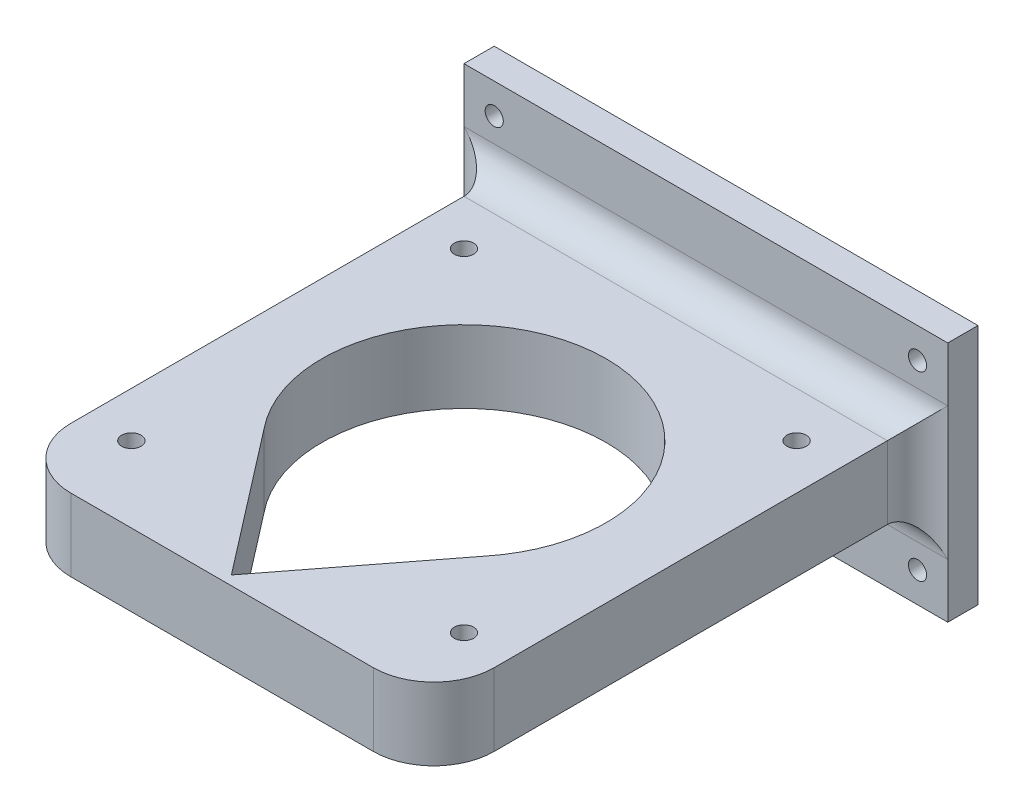
ISO-10303-21;
HEADER;
FILE_DESCRIPTION(('STEP AP214'),'2;1');
FILE_NAME('part.step','',(''),(''),'','','');
FILE_SCHEMA(('AUTOMOTIVE_DESIGN { 1 0 10303 214 1 1 1 1 }'));
ENDSEC;
DATA;
#1=APPLICATION_CONTEXT('core data for automotive mechanical design processes');
#2=APPLICATION_PROTOCOL_DEFINITION('international standard','automotive_design',2000,#1);
#3=PRODUCT_CONTEXT('',#1,'mechanical');
#4=PRODUCT('Part','Part','',(#3));
#5=PRODUCT_RELATED_PRODUCT_CATEGORY('part','',(#4));
#6=PRODUCT_DEFINITION_FORMATION('','',#4);
#7=PRODUCT_DEFINITION_CONTEXT('part definition',#1,'design');
#8=PRODUCT_DEFINITION('design','',#6,#7);
#9=PRODUCT_DEFINITION_SHAPE('','',#8);
#10=(LENGTH_UNIT() NAMED_UNIT(*) SI_UNIT(.MILLI.,.METRE.));
#11=(NAMED_UNIT(*) PLANE_ANGLE_UNIT() SI_UNIT($,.RADIAN.));
#12=(NAMED_UNIT(*) SI_UNIT($,.STERADIAN.) SOLID_ANGLE_UNIT());
#13=UNCERTAINTY_MEASURE_WITH_UNIT(LENGTH_MEASURE(1.E-05),#10,'distance_accuracy_value','');
#14=(GEOMETRIC_REPRESENTATION_CONTEXT(3) GLOBAL_UNCERTAINTY_ASSIGNED_CONTEXT((#13)) GLOBAL_UNIT_ASSIGNED_CONTEXT((#10,
#11,#12)) REPRESENTATION_CONTEXT('',''));
#15=CARTESIAN_POINT('',(0.,0.,0.));
#16=DIRECTION('',(0.,0.,1.));
#17=DIRECTION('',(1.,0.,0.));
#18=AXIS2_PLACEMENT_3D('',#15,#16,#17);
#19=CARTESIAN_POINT('',(25.,12.,30.));
#20=DIRECTION('',(0.,1.,0.));
#21=DIRECTION('',(0.,0.,1.));
#22=AXIS2_PLACEMENT_3D('',#19,#20,#21);
#23=CYLINDRICAL_SURFACE('',#22,10.);
#24=DIRECTION('',(0.,1.,0.));
#25=VECTOR('',#24,1.);
#26=CARTESIAN_POINT('',(25.,12.,40.));
#27=LINE('',#26,#25);
#28=CARTESIAN_POINT('',(25.,0.,40.));
#29=VERTEX_POINT('',#28);
#30=CARTESIAN_POINT('',(25.,12.,40.));
#31=VERTEX_POINT('',#30);
#32=EDGE_CURVE('E373',#29,#31,#27,.T.);
#33=ORIENTED_EDGE('',*,*,#32,.F.);
#34=CARTESIAN_POINT('',(25.,0.,30.));
#35=DIRECTION('',(0.,1.,0.));
#36=DIRECTION('',(0.,0.,1.));
#37=AXIS2_PLACEMENT_3D('',#34,#35,#36);
#38=CIRCLE('',#37,10.);
#39=CARTESIAN_POINT('',(35.,0.,30.));
#40=VERTEX_POINT('',#39);
#41=EDGE_CURVE('E53',#40,#29,#38,.F.);
#42=ORIENTED_EDGE('',*,*,#41,.F.);
#43=DIRECTION('',(0.,1.,0.));
#44=VECTOR('',#43,1.);
#45=CARTESIAN_POINT('',(35.,12.,30.));
#46=LINE('',#45,#44);
#47=CARTESIAN_POINT('',(35.,12.,30.));
#48=VERTEX_POINT('',#47);
#49=EDGE_CURVE('E377',#48,#40,#46,.F.);
#50=ORIENTED_EDGE('',*,*,#49,.F.);
#51=CARTESIAN_POINT('',(25.,12.,30.));
#52=DIRECTION('',(0.,1.,0.));
#53=DIRECTION('',(0.,0.,1.));
#54=AXIS2_PLACEMENT_3D('',#51,#52,#53);
#55=CIRCLE('',#54,10.);
#56=EDGE_CURVE('E11',#31,#48,#55,.T.);
#57=ORIENTED_EDGE('',*,*,#56,.F.);
#58=EDGE_LOOP('',(#33,#42,#50,#57));
#59=FACE_BOUND('',#58,.T.);
#60=ADVANCED_FACE('F45',(#59),#23,.T.);
#61=CARTESIAN_POINT('',(-25.,12.,30.));
#62=DIRECTION('',(0.,1.,0.));
#63=DIRECTION('',(0.,0.,1.));
#64=AXIS2_PLACEMENT_3D('',#61,#62,#63);
#65=CYLINDRICAL_SURFACE('',#64,10.);
#66=DIRECTION('',(0.,-1.,0.));
#67=VECTOR('',#66,1.);
#68=CARTESIAN_POINT('',(-25.,12.,40.));
#69=LINE('',#68,#67);
#70=CARTESIAN_POINT('',(-25.,12.,40.));
#71=VERTEX_POINT('',#70);
#72=CARTESIAN_POINT('',(-25.,0.,40.));
#73=VERTEX_POINT('',#72);
#74=EDGE_CURVE('E359',#71,#73,#69,.T.);
#75=ORIENTED_EDGE('',*,*,#74,.F.);
#76=CARTESIAN_POINT('',(-25.,12.,30.));
#77=DIRECTION('',(0.,1.,0.));
#78=DIRECTION('',(0.,0.,1.));
#79=AXIS2_PLACEMENT_3D('',#76,#77,#78);
#80=CIRCLE('',#79,10.);
#81=CARTESIAN_POINT('',(-35.,12.,30.));
#82=VERTEX_POINT('',#81);
#83=EDGE_CURVE('E367',#82,#71,#80,.T.);
#84=ORIENTED_EDGE('',*,*,#83,.F.);
#85=DIRECTION('',(0.,-1.,0.));
#86=VECTOR('',#85,1.);
#87=CARTESIAN_POINT('',(-35.,12.,30.));
#88=LINE('',#87,#86);
#89=CARTESIAN_POINT('',(-35.,0.,30.));
#90=VERTEX_POINT('',#89);
#91=EDGE_CURVE('E363',#90,#82,#88,.F.);
#92=ORIENTED_EDGE('',*,*,#91,.F.);
#93=CARTESIAN_POINT('',(-25.,0.,30.));
#94=DIRECTION('',(0.,1.,0.));
#95=DIRECTION('',(0.,0.,1.));
#96=AXIS2_PLACEMENT_3D('',#93,#94,#95);
#97=CIRCLE('',#96,10.);
#98=EDGE_CURVE('E370',#73,#90,#97,.F.);
#99=ORIENTED_EDGE('',*,*,#98,.F.);
#100=EDGE_LOOP('',(#75,#84,#92,#99));
#101=FACE_BOUND('',#100,.T.);
#102=ADVANCED_FACE('F389',(#101),#65,.T.);
#103=CARTESIAN_POINT('',(0.,12.,0.));
#104=DIRECTION('',(0.,-1.,0.));
#105=DIRECTION('',(0.,0.,-1.));
#106=AXIS2_PLACEMENT_3D('',#103,#104,#105);
#107=CYLINDRICAL_SURFACE('',#106,23.5);
#108=CARTESIAN_POINT('',(0.,12.,0.));
#109=DIRECTION('',(0.,1.,0.));
#110=DIRECTION('',(0.,0.,1.));
#111=AXIS2_PLACEMENT_3D('',#108,#109,#110);
#112=CIRCLE('',#111,23.5);
#113=CARTESIAN_POINT('',(18.2335117608208,12.,14.8252841074972));
#114=VERTEX_POINT('',#113);
#115=CARTESIAN_POINT('',(-18.2335117608211,12.,14.8252841074968));
#116=VERTEX_POINT('',#115);
#117=EDGE_CURVE('E290',#114,#116,#112,.T.);
#118=ORIENTED_EDGE('',*,*,#117,.T.);
#119=DIRECTION('',(0.,1.,0.));
#120=VECTOR('',#119,1.);
#121=CARTESIAN_POINT('',(-18.2335117608211,0.,14.8252841074968));
#122=LINE('',#121,#120);
#123=CARTESIAN_POINT('',(-18.2335117608211,0.,14.8252841074968));
#124=VERTEX_POINT('',#123);
#125=EDGE_CURVE('E180',#124,#116,#122,.T.);
#126=ORIENTED_EDGE('',*,*,#125,.F.);
#127=CARTESIAN_POINT('',(0.,0.,0.));
#128=DIRECTION('',(0.,1.,0.));
#129=DIRECTION('',(0.,0.,1.));
#130=AXIS2_PLACEMENT_3D('',#127,#128,#129);
#131=CIRCLE('',#130,23.5);
#132=CARTESIAN_POINT('',(18.2335117608208,0.,14.8252841074973));
#133=VERTEX_POINT('',#132);
#134=EDGE_CURVE('E171',#133,#124,#131,.T.);
#135=ORIENTED_EDGE('',*,*,#134,.F.);
#136=DIRECTION('',(0.,1.,0.));
#137=VECTOR('',#136,1.);
#138=CARTESIAN_POINT('',(18.2335117608208,0.,14.8252841074972));
#139=LINE('',#138,#137);
#140=EDGE_CURVE('E159',#133,#114,#139,.T.);
#141=ORIENTED_EDGE('',*,*,#140,.T.);
#142=EDGE_LOOP('',(#118,#126,#135,#141));
#143=FACE_BOUND('',#142,.T.);
#144=ADVANCED_FACE('F421',(#143),#107,.F.);
#145=CARTESIAN_POINT('',(0.,12.,0.));
#146=DIRECTION('',(0.,1.,0.));
#147=DIRECTION('',(0.,0.,1.));
#148=AXIS2_PLACEMENT_3D('',#145,#146,#147);
#149=PLANE('',#148);
#150=CARTESIAN_POINT('',(-27.5,12.,-27.5));
#151=DIRECTION('',(0.,1.,0.));
#152=DIRECTION('',(0.,0.,1.));
#153=AXIS2_PLACEMENT_3D('',#150,#151,#152);
#154=CIRCLE('',#153,1.6);
#155=CARTESIAN_POINT('',(-27.5,12.,-25.9));
#156=VERTEX_POINT('',#155);
#157=EDGE_CURVE('E265',#156,#156,#154,.T.);
#158=ORIENTED_EDGE('',*,*,#157,.F.);
#159=EDGE_LOOP('',(#158));
#160=FACE_BOUND('',#159,.T.);
#161=CARTESIAN_POINT('',(27.5000000000001,12.,-27.4999999999999));
#162=DIRECTION('',(0.,1.,0.));
#163=DIRECTION('',(0.,0.,1.));
#164=AXIS2_PLACEMENT_3D('',#161,#162,#163);
#165=CIRCLE('',#164,1.6);
#166=CARTESIAN_POINT('',(27.5000000000001,12.,-25.8999999999999));
#167=VERTEX_POINT('',#166);
#168=EDGE_CURVE('E269',#167,#167,#165,.T.);
#169=ORIENTED_EDGE('',*,*,#168,.F.);
#170=EDGE_LOOP('',(#169));
#171=FACE_BOUND('',#170,.T.);
#172=CARTESIAN_POINT('',(-27.5000000000003,12.,27.4999999999997));
#173=DIRECTION('',(0.,1.,0.));
#174=DIRECTION('',(0.,0.,1.));
#175=AXIS2_PLACEMENT_3D('',#172,#173,#174);
#176=CIRCLE('',#175,1.6);
#177=CARTESIAN_POINT('',(-27.5000000000003,12.,29.0999999999997));
#178=VERTEX_POINT('',#177);
#179=EDGE_CURVE('E273',#178,#178,#176,.T.);
#180=ORIENTED_EDGE('',*,*,#179,.F.);
#181=EDGE_LOOP('',(#180));
#182=FACE_BOUND('',#181,.T.);
#183=CARTESIAN_POINT('',(27.4999999999998,12.,27.5000000000002));
#184=DIRECTION('',(0.,1.,0.));
#185=DIRECTION('',(0.,0.,1.));
#186=AXIS2_PLACEMENT_3D('',#183,#184,#185);
#187=CIRCLE('',#186,1.6);
#188=CARTESIAN_POINT('',(27.4999999999998,12.,29.1000000000002));
#189=VERTEX_POINT('',#188);
#190=EDGE_CURVE('E277',#189,#189,#187,.T.);
#191=ORIENTED_EDGE('',*,*,#190,.F.);
#192=EDGE_LOOP('',(#191));
#193=FACE_BOUND('',#192,.T.);
#194=DIRECTION('',(1.,0.,0.));
#195=VECTOR('',#194,1.);
#196=CARTESIAN_POINT('',(0.,12.,40.));
#197=LINE('',#196,#195);
#198=EDGE_CURVE('E281',#71,#31,#197,.T.);
#199=ORIENTED_EDGE('',*,*,#198,.T.);
#200=ORIENTED_EDGE('',*,*,#56,.T.);
#201=DIRECTION('',(0.,0.,-1.));
#202=VECTOR('',#201,1.);
#203=CARTESIAN_POINT('',(35.,12.,0.));
#204=LINE('',#203,#202);
#205=CARTESIAN_POINT('',(35.,12.,-35.));
#206=VERTEX_POINT('',#205);
#207=EDGE_CURVE('E284',#48,#206,#204,.T.);
#208=ORIENTED_EDGE('',*,*,#207,.T.);
#209=DIRECTION('',(-1.,0.,0.));
#210=VECTOR('',#209,1.);
#211=CARTESIAN_POINT('',(0.,12.,-35.));
#212=LINE('',#211,#210);
#213=CARTESIAN_POINT('',(-35.,12.,-35.));
#214=VERTEX_POINT('',#213);
#215=EDGE_CURVE('E294',#206,#214,#212,.T.);
#216=ORIENTED_EDGE('',*,*,#215,.T.);
#217=DIRECTION('',(0.,0.,-1.));
#218=VECTOR('',#217,1.);
#219=CARTESIAN_POINT('',(-35.,12.,0.));
#220=LINE('',#219,#218);
#221=EDGE_CURVE('E287',#82,#214,#220,.T.);
#222=ORIENTED_EDGE('',*,*,#221,.F.);
#223=ORIENTED_EDGE('',*,*,#83,.T.);
#224=EDGE_LOOP('',(#199,#200,#208,#216,#222,#223));
#225=FACE_BOUND('',#224,.T.);
#226=DIRECTION('',(0.610805106297056,0.,-0.791780981156685));
#227=VECTOR('',#226,1.);
#228=CARTESIAN_POINT('',(18.6007619392056,12.,14.34922111527));
#229=LINE('',#228,#227);
#230=CARTESIAN_POINT('',(0.,12.,38.4612159015799));
#231=VERTEX_POINT('',#230);
#232=EDGE_CURVE('E173',#231,#114,#229,.T.);
#233=ORIENTED_EDGE('',*,*,#232,.F.);
#234=DIRECTION('',(-0.610805106297056,0.,-0.791780981156685));
#235=VECTOR('',#234,1.);
#236=CARTESIAN_POINT('',(-18.6007619392056,12.,14.34922111527));
#237=LINE('',#236,#235);
#238=EDGE_CURVE('E155',#231,#116,#237,.T.);
#239=ORIENTED_EDGE('',*,*,#238,.T.);
#240=ORIENTED_EDGE('',*,*,#117,.F.);
#241=EDGE_LOOP('',(#233,#239,#240));
#242=FACE_BOUND('',#241,.T.);
#243=ADVANCED_FACE('F418',(#160,#171,#182,#193,#225,#242),#149,.T.);
#244=CARTESIAN_POINT('',(0.,0.,0.));
#245=DIRECTION('',(0.,1.,0.));
#246=DIRECTION('',(0.,0.,1.));
#247=AXIS2_PLACEMENT_3D('',#244,#245,#246);
#248=PLANE('',#247);
#249=DIRECTION('',(0.,0.,-1.));
#250=VECTOR('',#249,1.);
#251=CARTESIAN_POINT('',(35.,0.,0.));
#252=LINE('',#251,#250);
#253=CARTESIAN_POINT('',(35.,0.,-35.));
#254=VERTEX_POINT('',#253);
#255=EDGE_CURVE('E314',#40,#254,#252,.T.);
#256=ORIENTED_EDGE('',*,*,#255,.F.);
#257=ORIENTED_EDGE('',*,*,#41,.T.);
#258=DIRECTION('',(1.,0.,0.));
#259=VECTOR('',#258,1.);
#260=CARTESIAN_POINT('',(0.,0.,40.));
#261=LINE('',#260,#259);
#262=EDGE_CURVE('E310',#73,#29,#261,.T.);
#263=ORIENTED_EDGE('',*,*,#262,.F.);
#264=ORIENTED_EDGE('',*,*,#98,.T.);
#265=DIRECTION('',(0.,0.,-1.));
#266=VECTOR('',#265,1.);
#267=CARTESIAN_POINT('',(-35.,0.,0.));
#268=LINE('',#267,#266);
#269=CARTESIAN_POINT('',(-35.,0.,-35.));
#270=VERTEX_POINT('',#269);
#271=EDGE_CURVE('E317',#90,#270,#268,.T.);
#272=ORIENTED_EDGE('',*,*,#271,.T.);
#273=DIRECTION('',(1.,0.,0.));
#274=VECTOR('',#273,1.);
#275=CARTESIAN_POINT('',(0.,0.,-35.));
#276=LINE('',#275,#274);
#277=EDGE_CURVE('E328',#270,#254,#276,.T.);
#278=ORIENTED_EDGE('',*,*,#277,.T.);
#279=EDGE_LOOP('',(#256,#257,#263,#264,#272,#278));
#280=FACE_BOUND('',#279,.T.);
#281=CARTESIAN_POINT('',(27.4999999999998,0.,27.5000000000002));
#282=DIRECTION('',(0.,1.,0.));
#283=DIRECTION('',(0.,0.,1.));
#284=AXIS2_PLACEMENT_3D('',#281,#282,#283);
#285=CIRCLE('',#284,1.6);
#286=CARTESIAN_POINT('',(27.4999999999998,0.,29.1000000000002));
#287=VERTEX_POINT('',#286);
#288=EDGE_CURVE('E306',#287,#287,#285,.T.);
#289=ORIENTED_EDGE('',*,*,#288,.T.);
#290=EDGE_LOOP('',(#289));
#291=FACE_BOUND('',#290,.T.);
#292=CARTESIAN_POINT('',(-27.5000000000003,0.,27.4999999999997));
#293=DIRECTION('',(0.,1.,0.));
#294=DIRECTION('',(0.,0.,1.));
#295=AXIS2_PLACEMENT_3D('',#292,#293,#294);
#296=CIRCLE('',#295,1.6);
#297=CARTESIAN_POINT('',(-27.5000000000003,0.,29.0999999999997));
#298=VERTEX_POINT('',#297);
#299=EDGE_CURVE('E302',#298,#298,#296,.T.);
#300=ORIENTED_EDGE('',*,*,#299,.T.);
#301=EDGE_LOOP('',(#300));
#302=FACE_BOUND('',#301,.T.);
#303=CARTESIAN_POINT('',(27.5000000000001,0.,-27.4999999999999));
#304=DIRECTION('',(0.,1.,0.));
#305=DIRECTION('',(0.,0.,1.));
#306=AXIS2_PLACEMENT_3D('',#303,#304,#305);
#307=CIRCLE('',#306,1.6);
#308=CARTESIAN_POINT('',(27.5000000000001,0.,-25.8999999999999));
#309=VERTEX_POINT('',#308);
#310=EDGE_CURVE('E298',#309,#309,#307,.T.);
#311=ORIENTED_EDGE('',*,*,#310,.T.);
#312=EDGE_LOOP('',(#311));
#313=FACE_BOUND('',#312,.T.);
#314=CARTESIAN_POINT('',(-27.5,0.,-27.5));
#315=DIRECTION('',(0.,1.,0.));
#316=DIRECTION('',(0.,0.,1.));
#317=AXIS2_PLACEMENT_3D('',#314,#315,#316);
#318=CIRCLE('',#317,1.6);
#319=CARTESIAN_POINT('',(-27.5,0.,-25.9));
#320=VERTEX_POINT('',#319);
#321=EDGE_CURVE('E264',#320,#320,#318,.T.);
#322=ORIENTED_EDGE('',*,*,#321,.T.);
#323=EDGE_LOOP('',(#322));
#324=FACE_BOUND('',#323,.T.);
#325=DIRECTION('',(-0.610805106297056,0.,-0.791780981156685));
#326=VECTOR('',#325,1.);
#327=CARTESIAN_POINT('',(-18.6007619392056,0.,14.34922111527));
#328=LINE('',#327,#326);
#329=CARTESIAN_POINT('',(0.,0.,38.4612159015799));
#330=VERTEX_POINT('',#329);
#331=EDGE_CURVE('E152',#330,#124,#328,.T.);
#332=ORIENTED_EDGE('',*,*,#331,.F.);
#333=DIRECTION('',(0.610805106297056,0.,-0.791780981156685));
#334=VECTOR('',#333,1.);
#335=CARTESIAN_POINT('',(18.6007619392056,0.,14.34922111527));
#336=LINE('',#335,#334);
#337=EDGE_CURVE('E160',#330,#133,#336,.T.);
#338=ORIENTED_EDGE('',*,*,#337,.T.);
#339=ORIENTED_EDGE('',*,*,#134,.T.);
#340=EDGE_LOOP('',(#332,#338,#339));
#341=FACE_BOUND('',#340,.T.);
#342=ADVANCED_FACE('F170',(#280,#291,#302,#313,#324,#341),#248,.F.);
#343=CARTESIAN_POINT('',(0.,0.,-40.));
#344=DIRECTION('',(0.,0.,1.));
#345=DIRECTION('',(1.,0.,0.));
#346=AXIS2_PLACEMENT_3D('',#343,#344,#345);
#347=PLANE('',#346);
#348=CARTESIAN_POINT('',(35.0000000000002,-8.99999999999978,-40.));
#349=DIRECTION('',(0.,0.,-1.));
#350=DIRECTION('',(-1.,0.,0.));
#351=AXIS2_PLACEMENT_3D('',#348,#349,#350);
#352=CIRCLE('',#351,1.5);
#353=CARTESIAN_POINT('',(33.5000000000002,-8.99999999999978,-40.));
#354=VERTEX_POINT('',#353);
#355=EDGE_CURVE('E195',#354,#354,#352,.T.);
#356=ORIENTED_EDGE('',*,*,#355,.T.);
#357=EDGE_LOOP('',(#356));
#358=FACE_BOUND('',#357,.T.);
#359=DIRECTION('',(1.,0.,0.));
#360=VECTOR('',#359,1.);
#361=CARTESIAN_POINT('',(0.,-5.,-40.));
#362=LINE('',#361,#360);
#363=CARTESIAN_POINT('',(40.,-5.,-40.));
#364=VERTEX_POINT('',#363);
#365=CARTESIAN_POINT('',(-40.,-5.,-40.));
#366=VERTEX_POINT('',#365);
#367=EDGE_CURVE('E332',#364,#366,#362,.F.);
#368=ORIENTED_EDGE('',*,*,#367,.T.);
#369=DIRECTION('',(0.,1.,0.));
#370=VECTOR('',#369,1.);
#371=CARTESIAN_POINT('',(-40.,-14.,-40.));
#372=LINE('',#371,#370);
#373=CARTESIAN_POINT('',(-40.,-14.,-40.));
#374=VERTEX_POINT('',#373);
#375=EDGE_CURVE('E233',#374,#366,#372,.T.);
#376=ORIENTED_EDGE('',*,*,#375,.F.);
#377=DIRECTION('',(-1.,0.,0.));
#378=VECTOR('',#377,1.);
#379=CARTESIAN_POINT('',(40.,-14.,-40.));
#380=LINE('',#379,#378);
#381=CARTESIAN_POINT('',(40.,-14.,-40.));
#382=VERTEX_POINT('',#381);
#383=EDGE_CURVE('E223',#382,#374,#380,.T.);
#384=ORIENTED_EDGE('',*,*,#383,.F.);
#385=DIRECTION('',(0.,-1.,0.));
#386=VECTOR('',#385,1.);
#387=CARTESIAN_POINT('',(40.,-14.,-40.));
#388=LINE('',#387,#386);
#389=EDGE_CURVE('E241',#364,#382,#388,.T.);
#390=ORIENTED_EDGE('',*,*,#389,.F.);
#391=EDGE_LOOP('',(#368,#376,#384,#390));
#392=FACE_BOUND('',#391,.T.);
#393=CARTESIAN_POINT('',(-35.,-9.00000000000001,-40.));
#394=DIRECTION('',(0.,0.,1.));
#395=DIRECTION('',(1.,0.,0.));
#396=AXIS2_PLACEMENT_3D('',#393,#394,#395);
#397=CIRCLE('',#396,1.5);
#398=CARTESIAN_POINT('',(-33.5,-9.00000000000001,-40.));
#399=VERTEX_POINT('',#398);
#400=EDGE_CURVE('E203',#399,#399,#397,.T.);
#401=ORIENTED_EDGE('',*,*,#400,.F.);
#402=EDGE_LOOP('',(#401));
#403=FACE_BOUND('',#402,.T.);
#404=ADVANCED_FACE('F453',(#358,#392,#403),#347,.T.);
#405=CARTESIAN_POINT('',(-35.,21.,-40.));
#406=DIRECTION('',(0.,0.,-1.));
#407=DIRECTION('',(-1.,0.,0.));
#408=AXIS2_PLACEMENT_3D('',#405,#406,#407);
#409=CIRCLE('',#408,1.5);
#410=CARTESIAN_POINT('',(-36.5,21.,-40.));
#411=VERTEX_POINT('',#410);
#412=EDGE_CURVE('E190',#411,#411,#409,.T.);
#413=ORIENTED_EDGE('',*,*,#412,.T.);
#414=EDGE_LOOP('',(#413));
#415=FACE_BOUND('',#414,.T.);
#416=CARTESIAN_POINT('',(-40.,17.,-40.));
#417=VERTEX_POINT('',#416);
#418=CARTESIAN_POINT('',(-40.,26.,-40.));
#419=VERTEX_POINT('',#418);
#420=EDGE_CURVE('E214',#417,#419,#372,.T.);
#421=ORIENTED_EDGE('',*,*,#420,.F.);
#422=DIRECTION('',(-1.,0.,0.));
#423=VECTOR('',#422,1.);
#424=CARTESIAN_POINT('',(0.,17.,-40.));
#425=LINE('',#424,#423);
#426=CARTESIAN_POINT('',(40.,17.,-40.));
#427=VERTEX_POINT('',#426);
#428=EDGE_CURVE('E325',#417,#427,#425,.F.);
#429=ORIENTED_EDGE('',*,*,#428,.T.);
#430=CARTESIAN_POINT('',(40.,26.,-40.));
#431=VERTEX_POINT('',#430);
#432=EDGE_CURVE('E242',#431,#427,#388,.T.);
#433=ORIENTED_EDGE('',*,*,#432,.F.);
#434=DIRECTION('',(1.,0.,0.));
#435=VECTOR('',#434,1.);
#436=CARTESIAN_POINT('',(40.,26.,-40.));
#437=LINE('',#436,#435);
#438=EDGE_CURVE('E237',#419,#431,#437,.T.);
#439=ORIENTED_EDGE('',*,*,#438,.F.);
#440=EDGE_LOOP('',(#421,#429,#433,#439));
#441=FACE_BOUND('',#440,.T.);
#442=CARTESIAN_POINT('',(35.,21.0000000000002,-40.));
#443=DIRECTION('',(0.,0.,1.));
#444=DIRECTION('',(1.,0.,0.));
#445=AXIS2_PLACEMENT_3D('',#442,#443,#444);
#446=CIRCLE('',#445,1.5);
#447=CARTESIAN_POINT('',(36.5,21.0000000000002,-40.));
#448=VERTEX_POINT('',#447);
#449=EDGE_CURVE('E186',#448,#448,#446,.T.);
#450=ORIENTED_EDGE('',*,*,#449,.F.);
#451=EDGE_LOOP('',(#450));
#452=FACE_BOUND('',#451,.T.);
#453=ADVANCED_FACE('F596',(#415,#441,#452),#347,.T.);
#454=CARTESIAN_POINT('',(0.,0.,-45.));
#455=DIRECTION('',(0.,0.,1.));
#456=DIRECTION('',(1.,0.,0.));
#457=AXIS2_PLACEMENT_3D('',#454,#455,#456);
#458=PLANE('',#457);
#459=CARTESIAN_POINT('',(35.,21.0000000000002,-45.));
#460=DIRECTION('',(0.,0.,1.));
#461=DIRECTION('',(1.,0.,0.));
#462=AXIS2_PLACEMENT_3D('',#459,#460,#461);
#463=CIRCLE('',#462,1.5);
#464=CARTESIAN_POINT('',(36.5,21.0000000000002,-45.));
#465=VERTEX_POINT('',#464);
#466=EDGE_CURVE('E191',#465,#465,#463,.T.);
#467=ORIENTED_EDGE('',*,*,#466,.T.);
#468=EDGE_LOOP('',(#467));
#469=FACE_BOUND('',#468,.T.);
#470=CARTESIAN_POINT('',(-35.,21.,-45.));
#471=DIRECTION('',(0.,0.,-1.));
#472=DIRECTION('',(-1.,0.,0.));
#473=AXIS2_PLACEMENT_3D('',#470,#471,#472);
#474=CIRCLE('',#473,1.5);
#475=CARTESIAN_POINT('',(-36.5,21.,-45.));
#476=VERTEX_POINT('',#475);
#477=EDGE_CURVE('E210',#476,#476,#474,.T.);
#478=ORIENTED_EDGE('',*,*,#477,.F.);
#479=EDGE_LOOP('',(#478));
#480=FACE_BOUND('',#479,.T.);
#481=DIRECTION('',(0.,1.,0.));
#482=VECTOR('',#481,1.);
#483=CARTESIAN_POINT('',(-40.,-14.,-45.));
#484=LINE('',#483,#482);
#485=CARTESIAN_POINT('',(-40.,-14.,-45.));
#486=VERTEX_POINT('',#485);
#487=CARTESIAN_POINT('',(-40.,26.,-45.));
#488=VERTEX_POINT('',#487);
#489=EDGE_CURVE('E218',#486,#488,#484,.T.);
#490=ORIENTED_EDGE('',*,*,#489,.T.);
#491=DIRECTION('',(1.,0.,0.));
#492=VECTOR('',#491,1.);
#493=CARTESIAN_POINT('',(40.,26.,-45.));
#494=LINE('',#493,#492);
#495=CARTESIAN_POINT('',(40.,26.,-45.));
#496=VERTEX_POINT('',#495);
#497=EDGE_CURVE('E222',#488,#496,#494,.T.);
#498=ORIENTED_EDGE('',*,*,#497,.T.);
#499=DIRECTION('',(0.,-1.,0.));
#500=VECTOR('',#499,1.);
#501=CARTESIAN_POINT('',(40.,-14.,-45.));
#502=LINE('',#501,#500);
#503=CARTESIAN_POINT('',(40.,-14.,-45.));
#504=VERTEX_POINT('',#503);
#505=EDGE_CURVE('E226',#496,#504,#502,.T.);
#506=ORIENTED_EDGE('',*,*,#505,.T.);
#507=DIRECTION('',(-1.,0.,0.));
#508=VECTOR('',#507,1.);
#509=CARTESIAN_POINT('',(40.,-14.,-45.));
#510=LINE('',#509,#508);
#511=EDGE_CURVE('E229',#504,#486,#510,.T.);
#512=ORIENTED_EDGE('',*,*,#511,.T.);
#513=EDGE_LOOP('',(#490,#498,#506,#512));
#514=FACE_BOUND('',#513,.T.);
#515=CARTESIAN_POINT('',(35.0000000000002,-8.99999999999978,-45.));
#516=DIRECTION('',(0.,0.,-1.));
#517=DIRECTION('',(-1.,0.,0.));
#518=AXIS2_PLACEMENT_3D('',#515,#516,#517);
#519=CIRCLE('',#518,1.5);
#520=CARTESIAN_POINT('',(33.5000000000002,-8.99999999999978,-45.));
#521=VERTEX_POINT('',#520);
#522=EDGE_CURVE('E199',#521,#521,#519,.T.);
#523=ORIENTED_EDGE('',*,*,#522,.F.);
#524=EDGE_LOOP('',(#523));
#525=FACE_BOUND('',#524,.T.);
#526=CARTESIAN_POINT('',(-35.,-9.00000000000001,-45.));
#527=DIRECTION('',(0.,0.,1.));
#528=DIRECTION('',(1.,0.,0.));
#529=AXIS2_PLACEMENT_3D('',#526,#527,#528);
#530=CIRCLE('',#529,1.5);
#531=CARTESIAN_POINT('',(-33.5,-9.00000000000001,-45.));
#532=VERTEX_POINT('',#531);
#533=EDGE_CURVE('E183',#532,#532,#530,.T.);
#534=ORIENTED_EDGE('',*,*,#533,.T.);
#535=EDGE_LOOP('',(#534));
#536=FACE_BOUND('',#535,.T.);
#537=ADVANCED_FACE('F587',(#469,#480,#514,#525,#536),#458,.F.);
#538=CARTESIAN_POINT('',(-40.,0.,-35.));
#539=DIRECTION('',(0.,-1.,0.));
#540=DIRECTION('',(0.,0.,-1.));
#541=AXIS2_PLACEMENT_3D('',#538,#539,#540);
#542=CYLINDRICAL_SURFACE('',#541,5.);
#543=EDGE_CURVE('E238',#366,#417,#372,.T.);
#544=ORIENTED_EDGE('',*,*,#543,.F.);
#545=CARTESIAN_POINT('',(-40.,-5.,-35.));
#546=DIRECTION('',(0.707106781186547,-0.707106781186547,0.));
#547=DIRECTION('',(0.707106781186547,0.707106781186547,0.));
#548=AXIS2_PLACEMENT_3D('',#545,#546,#547);
#549=ELLIPSE('',#548,7.07106781186547,5.);
#550=EDGE_CURVE('E351',#366,#270,#549,.T.);
#551=ORIENTED_EDGE('',*,*,#550,.T.);
#552=DIRECTION('',(0.,1.,0.));
#553=VECTOR('',#552,1.);
#554=CARTESIAN_POINT('',(-35.,0.,-35.));
#555=LINE('',#554,#553);
#556=EDGE_CURVE('E347',#214,#270,#555,.F.);
#557=ORIENTED_EDGE('',*,*,#556,.F.);
#558=CARTESIAN_POINT('',(-40.,17.,-35.));
#559=DIRECTION('',(0.707106781186547,0.707106781186547,0.));
#560=DIRECTION('',(0.707106781186547,-0.707106781186547,0.));
#561=AXIS2_PLACEMENT_3D('',#558,#559,#560);
#562=ELLIPSE('',#561,7.07106781186547,5.);
#563=EDGE_CURVE('E355',#214,#417,#562,.T.);
#564=ORIENTED_EDGE('',*,*,#563,.T.);
#565=EDGE_LOOP('',(#544,#551,#557,#564));
#566=FACE_BOUND('',#565,.T.);
#567=ADVANCED_FACE('F398',(#566),#542,.F.);
#568=CARTESIAN_POINT('',(40.,12.,-35.));
#569=DIRECTION('',(0.,1.,0.));
#570=DIRECTION('',(0.,0.,1.));
#571=AXIS2_PLACEMENT_3D('',#568,#569,#570);
#572=CYLINDRICAL_SURFACE('',#571,5.);
#573=DIRECTION('',(0.,1.,0.));
#574=VECTOR('',#573,1.);
#575=CARTESIAN_POINT('',(35.,12.,-35.));
#576=LINE('',#575,#574);
#577=EDGE_CURVE('E335',#254,#206,#576,.T.);
#578=ORIENTED_EDGE('',*,*,#577,.F.);
#579=CARTESIAN_POINT('',(40.,-5.,-35.));
#580=DIRECTION('',(0.707106781186547,0.707106781186547,0.));
#581=DIRECTION('',(0.707106781186547,-0.707106781186547,0.));
#582=AXIS2_PLACEMENT_3D('',#579,#580,#581);
#583=ELLIPSE('',#582,7.07106781186547,5.);
#584=EDGE_CURVE('E339',#254,#364,#583,.F.);
#585=ORIENTED_EDGE('',*,*,#584,.T.);
#586=EDGE_CURVE('E246',#427,#364,#388,.T.);
#587=ORIENTED_EDGE('',*,*,#586,.F.);
#588=CARTESIAN_POINT('',(40.,17.,-35.));
#589=DIRECTION('',(0.707106781186547,-0.707106781186547,0.));
#590=DIRECTION('',(0.707106781186547,0.707106781186547,0.));
#591=AXIS2_PLACEMENT_3D('',#588,#589,#590);
#592=ELLIPSE('',#591,7.07106781186547,5.);
#593=EDGE_CURVE('E343',#427,#206,#592,.F.);
#594=ORIENTED_EDGE('',*,*,#593,.T.);
#595=EDGE_LOOP('',(#578,#585,#587,#594));
#596=FACE_BOUND('',#595,.T.);
#597=ADVANCED_FACE('F410',(#596),#572,.F.);
#598=CARTESIAN_POINT('',(0.,-5.,-35.));
#599=DIRECTION('',(1.,0.,0.));
#600=DIRECTION('',(0.,0.,-1.));
#601=AXIS2_PLACEMENT_3D('',#598,#599,#600);
#602=CYLINDRICAL_SURFACE('',#601,5.);
#603=ORIENTED_EDGE('',*,*,#277,.F.);
#604=ORIENTED_EDGE('',*,*,#550,.F.);
#605=ORIENTED_EDGE('',*,*,#367,.F.);
#606=ORIENTED_EDGE('',*,*,#584,.F.);
#607=EDGE_LOOP('',(#603,#604,#605,#606));
#608=FACE_BOUND('',#607,.T.);
#609=ADVANCED_FACE('F405',(#608),#602,.F.);
#610=CARTESIAN_POINT('',(0.,17.,-35.));
#611=DIRECTION('',(1.,0.,0.));
#612=DIRECTION('',(0.,0.,-1.));
#613=AXIS2_PLACEMENT_3D('',#610,#611,#612);
#614=CYLINDRICAL_SURFACE('',#613,5.);
#615=ORIENTED_EDGE('',*,*,#215,.F.);
#616=ORIENTED_EDGE('',*,*,#593,.F.);
#617=ORIENTED_EDGE('',*,*,#428,.F.);
#618=ORIENTED_EDGE('',*,*,#563,.F.);
#619=EDGE_LOOP('',(#615,#616,#617,#618));
#620=FACE_BOUND('',#619,.T.);
#621=ADVANCED_FACE('F417',(#620),#614,.F.);
#622=CARTESIAN_POINT('',(0.,12.,40.));
#623=DIRECTION('',(0.,0.,-1.));
#624=DIRECTION('',(-1.,0.,0.));
#625=AXIS2_PLACEMENT_3D('',#622,#623,#624);
#626=PLANE('',#625);
#627=ORIENTED_EDGE('',*,*,#262,.T.);
#628=ORIENTED_EDGE('',*,*,#32,.T.);
#629=ORIENTED_EDGE('',*,*,#198,.F.);
#630=ORIENTED_EDGE('',*,*,#74,.T.);
#631=EDGE_LOOP('',(#627,#628,#629,#630));
#632=FACE_BOUND('',#631,.T.);
#633=ADVANCED_FACE('F386',(#632),#626,.F.);
#634=CARTESIAN_POINT('',(35.,12.,0.));
#635=DIRECTION('',(-1.,0.,0.));
#636=DIRECTION('',(0.,0.,1.));
#637=AXIS2_PLACEMENT_3D('',#634,#635,#636);
#638=PLANE('',#637);
#639=ORIENTED_EDGE('',*,*,#207,.F.);
#640=ORIENTED_EDGE('',*,*,#49,.T.);
#641=ORIENTED_EDGE('',*,*,#255,.T.);
#642=ORIENTED_EDGE('',*,*,#577,.T.);
#643=EDGE_LOOP('',(#639,#640,#641,#642));
#644=FACE_BOUND('',#643,.T.);
#645=ADVANCED_FACE('F415',(#644),#638,.F.);
#646=CARTESIAN_POINT('',(-35.,12.,0.));
#647=DIRECTION('',(-1.,0.,0.));
#648=DIRECTION('',(0.,0.,1.));
#649=AXIS2_PLACEMENT_3D('',#646,#647,#648);
#650=PLANE('',#649);
#651=ORIENTED_EDGE('',*,*,#271,.F.);
#652=ORIENTED_EDGE('',*,*,#91,.T.);
#653=ORIENTED_EDGE('',*,*,#221,.T.);
#654=ORIENTED_EDGE('',*,*,#556,.T.);
#655=EDGE_LOOP('',(#651,#652,#653,#654));
#656=FACE_BOUND('',#655,.T.);
#657=ADVANCED_FACE('F401',(#656),#650,.T.);
#658=CARTESIAN_POINT('',(27.4999999999998,12.,27.5000000000002));
#659=DIRECTION('',(0.,-1.,0.));
#660=DIRECTION('',(0.,0.,-1.));
#661=AXIS2_PLACEMENT_3D('',#658,#659,#660);
#662=CYLINDRICAL_SURFACE('',#661,1.6);
#663=ORIENTED_EDGE('',*,*,#190,.T.);
#664=EDGE_LOOP('',(#663));
#665=FACE_BOUND('',#664,.T.);
#666=ORIENTED_EDGE('',*,*,#288,.F.);
#667=EDGE_LOOP('',(#666));
#668=FACE_BOUND('',#667,.T.);
#669=ADVANCED_FACE('F475',(#665,#668),#662,.F.);
#670=CARTESIAN_POINT('',(-27.5000000000003,12.,27.4999999999997));
#671=DIRECTION('',(0.,-1.,0.));
#672=DIRECTION('',(0.,0.,-1.));
#673=AXIS2_PLACEMENT_3D('',#670,#671,#672);
#674=CYLINDRICAL_SURFACE('',#673,1.6);
#675=ORIENTED_EDGE('',*,*,#179,.T.);
#676=EDGE_LOOP('',(#675));
#677=FACE_BOUND('',#676,.T.);
#678=ORIENTED_EDGE('',*,*,#299,.F.);
#679=EDGE_LOOP('',(#678));
#680=FACE_BOUND('',#679,.T.);
#681=ADVANCED_FACE('F482',(#677,#680),#674,.F.);
#682=CARTESIAN_POINT('',(27.5000000000001,12.,-27.4999999999999));
#683=DIRECTION('',(0.,-1.,0.));
#684=DIRECTION('',(0.,0.,-1.));
#685=AXIS2_PLACEMENT_3D('',#682,#683,#684);
#686=CYLINDRICAL_SURFACE('',#685,1.6);
#687=ORIENTED_EDGE('',*,*,#168,.T.);
#688=EDGE_LOOP('',(#687));
#689=FACE_BOUND('',#688,.T.);
#690=ORIENTED_EDGE('',*,*,#310,.F.);
#691=EDGE_LOOP('',(#690));
#692=FACE_BOUND('',#691,.T.);
#693=ADVANCED_FACE('F492',(#689,#692),#686,.F.);
#694=CARTESIAN_POINT('',(-27.5,12.,-27.5));
#695=DIRECTION('',(0.,-1.,0.));
#696=DIRECTION('',(0.,0.,-1.));
#697=AXIS2_PLACEMENT_3D('',#694,#695,#696);
#698=CYLINDRICAL_SURFACE('',#697,1.6);
#699=ORIENTED_EDGE('',*,*,#157,.T.);
#700=EDGE_LOOP('',(#699));
#701=FACE_BOUND('',#700,.T.);
#702=ORIENTED_EDGE('',*,*,#321,.F.);
#703=EDGE_LOOP('',(#702));
#704=FACE_BOUND('',#703,.T.);
#705=ADVANCED_FACE('F502',(#701,#704),#698,.F.);
#706=CARTESIAN_POINT('',(-40.,-14.,-45.));
#707=DIRECTION('',(1.,0.,0.));
#708=DIRECTION('',(0.,0.,-1.));
#709=AXIS2_PLACEMENT_3D('',#706,#707,#708);
#710=PLANE('',#709);
#711=ORIENTED_EDGE('',*,*,#375,.T.);
#712=ORIENTED_EDGE('',*,*,#543,.T.);
#713=ORIENTED_EDGE('',*,*,#420,.T.);
#714=DIRECTION('',(0.,0.,1.));
#715=VECTOR('',#714,1.);
#716=CARTESIAN_POINT('',(-40.,26.,-45.));
#717=LINE('',#716,#715);
#718=EDGE_CURVE('E260',#488,#419,#717,.T.);
#719=ORIENTED_EDGE('',*,*,#718,.F.);
#720=ORIENTED_EDGE('',*,*,#489,.F.);
#721=DIRECTION('',(0.,0.,1.));
#722=VECTOR('',#721,1.);
#723=CARTESIAN_POINT('',(-40.,-14.,-45.));
#724=LINE('',#723,#722);
#725=EDGE_CURVE('E232',#486,#374,#724,.T.);
#726=ORIENTED_EDGE('',*,*,#725,.T.);
#727=EDGE_LOOP('',(#711,#712,#713,#719,#720,#726));
#728=FACE_BOUND('',#727,.T.);
#729=ADVANCED_FACE('F512',(#728),#710,.F.);
#730=CARTESIAN_POINT('',(40.,26.,-45.));
#731=DIRECTION('',(0.,-1.,0.));
#732=DIRECTION('',(0.,0.,-1.));
#733=AXIS2_PLACEMENT_3D('',#730,#731,#732);
#734=PLANE('',#733);
#735=ORIENTED_EDGE('',*,*,#438,.T.);
#736=DIRECTION('',(0.,0.,1.));
#737=VECTOR('',#736,1.);
#738=CARTESIAN_POINT('',(40.,26.,-45.));
#739=LINE('',#738,#737);
#740=EDGE_CURVE('E256',#496,#431,#739,.T.);
#741=ORIENTED_EDGE('',*,*,#740,.F.);
#742=ORIENTED_EDGE('',*,*,#497,.F.);
#743=ORIENTED_EDGE('',*,*,#718,.T.);
#744=EDGE_LOOP('',(#735,#741,#742,#743));
#745=FACE_BOUND('',#744,.T.);
#746=ADVANCED_FACE('F523',(#745),#734,.F.);
#747=CARTESIAN_POINT('',(40.,-14.,-45.));
#748=DIRECTION('',(-1.,0.,0.));
#749=DIRECTION('',(0.,0.,1.));
#750=AXIS2_PLACEMENT_3D('',#747,#748,#749);
#751=PLANE('',#750);
#752=ORIENTED_EDGE('',*,*,#432,.T.);
#753=ORIENTED_EDGE('',*,*,#586,.T.);
#754=ORIENTED_EDGE('',*,*,#389,.T.);
#755=DIRECTION('',(0.,0.,1.));
#756=VECTOR('',#755,1.);
#757=CARTESIAN_POINT('',(40.,-14.,-45.));
#758=LINE('',#757,#756);
#759=EDGE_CURVE('E252',#504,#382,#758,.T.);
#760=ORIENTED_EDGE('',*,*,#759,.F.);
#761=ORIENTED_EDGE('',*,*,#505,.F.);
#762=ORIENTED_EDGE('',*,*,#740,.T.);
#763=EDGE_LOOP('',(#752,#753,#754,#760,#761,#762));
#764=FACE_BOUND('',#763,.T.);
#765=ADVANCED_FACE('F534',(#764),#751,.F.);
#766=CARTESIAN_POINT('',(40.,-14.,-45.));
#767=DIRECTION('',(0.,1.,0.));
#768=DIRECTION('',(0.,0.,1.));
#769=AXIS2_PLACEMENT_3D('',#766,#767,#768);
#770=PLANE('',#769);
#771=ORIENTED_EDGE('',*,*,#383,.T.);
#772=ORIENTED_EDGE('',*,*,#725,.F.);
#773=ORIENTED_EDGE('',*,*,#511,.F.);
#774=ORIENTED_EDGE('',*,*,#759,.T.);
#775=EDGE_LOOP('',(#771,#772,#773,#774));
#776=FACE_BOUND('',#775,.T.);
#777=ADVANCED_FACE('F545',(#776),#770,.F.);
#778=CARTESIAN_POINT('',(-35.,21.,-45.));
#779=DIRECTION('',(0.,0.,1.));
#780=DIRECTION('',(1.,0.,0.));
#781=AXIS2_PLACEMENT_3D('',#778,#779,#780);
#782=CYLINDRICAL_SURFACE('',#781,1.5);
#783=ORIENTED_EDGE('',*,*,#477,.T.);
#784=EDGE_LOOP('',(#783));
#785=FACE_BOUND('',#784,.T.);
#786=ORIENTED_EDGE('',*,*,#412,.F.);
#787=EDGE_LOOP('',(#786));
#788=FACE_BOUND('',#787,.T.);
#789=ADVANCED_FACE('F556',(#785,#788),#782,.F.);
#790=CARTESIAN_POINT('',(35.,21.0000000000002,-45.));
#791=DIRECTION('',(0.,0.,1.));
#792=DIRECTION('',(1.,0.,0.));
#793=AXIS2_PLACEMENT_3D('',#790,#791,#792);
#794=CYLINDRICAL_SURFACE('',#793,1.5);
#795=ORIENTED_EDGE('',*,*,#466,.F.);
#796=EDGE_LOOP('',(#795));
#797=FACE_BOUND('',#796,.T.);
#798=ORIENTED_EDGE('',*,*,#449,.T.);
#799=EDGE_LOOP('',(#798));
#800=FACE_BOUND('',#799,.T.);
#801=ADVANCED_FACE('F621',(#797,#800),#794,.F.);
#802=CARTESIAN_POINT('',(35.0000000000002,-8.99999999999978,-45.));
#803=DIRECTION('',(0.,0.,1.));
#804=DIRECTION('',(1.,0.,0.));
#805=AXIS2_PLACEMENT_3D('',#802,#803,#804);
#806=CYLINDRICAL_SURFACE('',#805,1.5);
#807=ORIENTED_EDGE('',*,*,#522,.T.);
#808=EDGE_LOOP('',(#807));
#809=FACE_BOUND('',#808,.T.);
#810=ORIENTED_EDGE('',*,*,#355,.F.);
#811=EDGE_LOOP('',(#810));
#812=FACE_BOUND('',#811,.T.);
#813=ADVANCED_FACE('F631',(#809,#812),#806,.F.);
#814=CARTESIAN_POINT('',(-35.,-9.00000000000001,-45.));
#815=DIRECTION('',(0.,0.,1.));
#816=DIRECTION('',(1.,0.,0.));
#817=AXIS2_PLACEMENT_3D('',#814,#815,#816);
#818=CYLINDRICAL_SURFACE('',#817,1.5);
#819=ORIENTED_EDGE('',*,*,#533,.F.);
#820=EDGE_LOOP('',(#819));
#821=FACE_BOUND('',#820,.T.);
#822=ORIENTED_EDGE('',*,*,#400,.T.);
#823=EDGE_LOOP('',(#822));
#824=FACE_BOUND('',#823,.T.);
#825=ADVANCED_FACE('F641',(#821,#824),#818,.F.);
#826=CARTESIAN_POINT('',(-18.6007619392056,0.,14.34922111527));
#827=DIRECTION('',(0.791780981156685,0.,-0.610805106297056));
#828=DIRECTION('',(-0.610805106297056,0.,-0.791780981156685));
#829=AXIS2_PLACEMENT_3D('',#826,#827,#828);
#830=PLANE('',#829);
#831=ORIENTED_EDGE('',*,*,#238,.F.);
#832=DIRECTION('',(0.,1.,0.));
#833=VECTOR('',#832,1.);
#834=CARTESIAN_POINT('',(0.,0.,38.4612159015799));
#835=LINE('',#834,#833);
#836=EDGE_CURVE('E148',#330,#231,#835,.T.);
#837=ORIENTED_EDGE('',*,*,#836,.F.);
#838=ORIENTED_EDGE('',*,*,#331,.T.);
#839=ORIENTED_EDGE('',*,*,#125,.T.);
#840=EDGE_LOOP('',(#831,#837,#838,#839));
#841=FACE_BOUND('',#840,.T.);
#842=ADVANCED_FACE('F150',(#841),#830,.T.);
#843=CARTESIAN_POINT('',(18.6007619392056,0.,14.34922111527));
#844=DIRECTION('',(0.791780981156685,0.,0.610805106297056));
#845=DIRECTION('',(0.610805106297056,0.,-0.791780981156685));
#846=AXIS2_PLACEMENT_3D('',#843,#844,#845);
#847=PLANE('',#846);
#848=ORIENTED_EDGE('',*,*,#232,.T.);
#849=ORIENTED_EDGE('',*,*,#140,.F.);
#850=ORIENTED_EDGE('',*,*,#337,.F.);
#851=ORIENTED_EDGE('',*,*,#836,.T.);
#852=EDGE_LOOP('',(#848,#849,#850,#851));
#853=FACE_BOUND('',#852,.T.);
#854=ADVANCED_FACE('F163',(#853),#847,.F.);
#855=CLOSED_SHELL('',(#60,#102,#144,#243,#342,#404,#453,#537,#567,#597,#609,#621,#633,#645,#657,
#669,#681,#693,#705,#729,#746,#765,#777,#789,#801,#813,#825,#842,#854));
#856=MANIFOLD_SOLID_BREP('B2',#855);
#857=ADVANCED_BREP_SHAPE_REPRESENTATION('',(#18,#856),#14);
#858=SHAPE_DEFINITION_REPRESENTATION(#9,#857);
ENDSEC;
END-ISO-10303-21;
